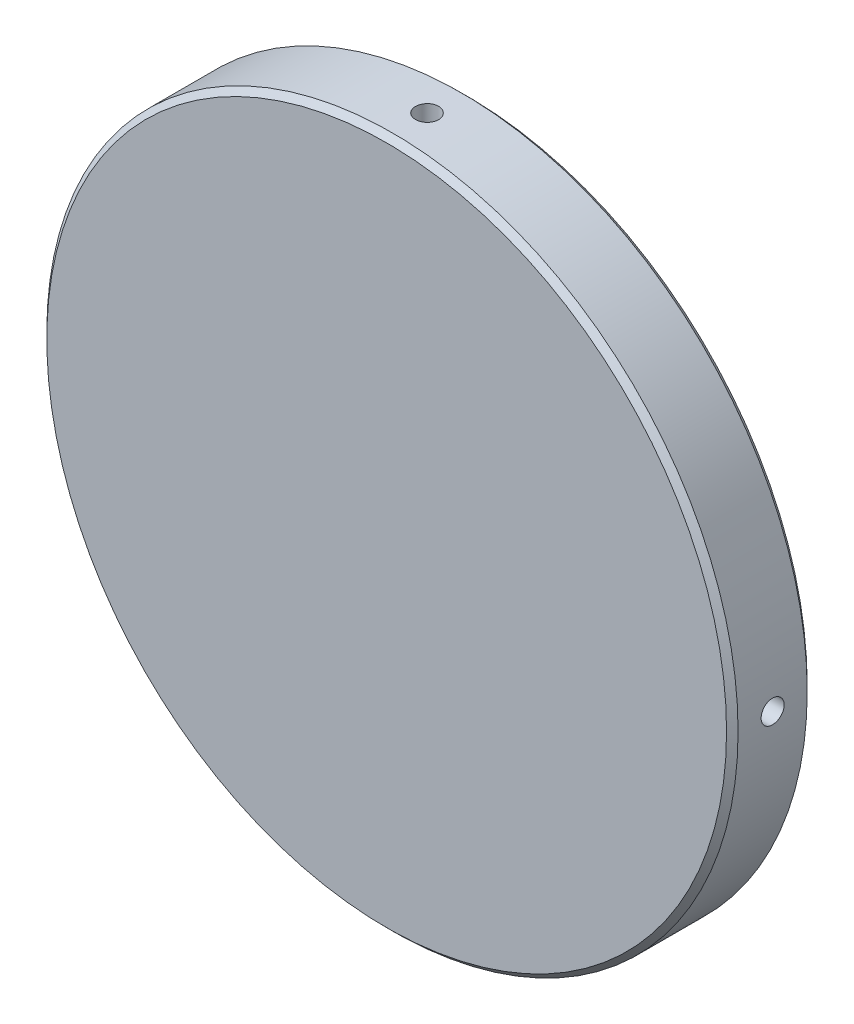
ISO-10303-21;
HEADER;
FILE_DESCRIPTION(('STEP AP214'),'2;1');
FILE_NAME('part.step','',(''),(''),'','','');
FILE_SCHEMA(('AUTOMOTIVE_DESIGN { 1 0 10303 214 1 1 1 1 }'));
ENDSEC;
DATA;
#1=APPLICATION_CONTEXT('core data for automotive mechanical design processes');
#2=APPLICATION_PROTOCOL_DEFINITION('international standard','automotive_design',2000,#1);
#3=PRODUCT_CONTEXT('',#1,'mechanical');
#4=PRODUCT('Part','Part','',(#3));
#5=PRODUCT_RELATED_PRODUCT_CATEGORY('part','',(#4));
#6=PRODUCT_DEFINITION_FORMATION('','',#4);
#7=PRODUCT_DEFINITION_CONTEXT('part definition',#1,'design');
#8=PRODUCT_DEFINITION('design','',#6,#7);
#9=PRODUCT_DEFINITION_SHAPE('','',#8);
#10=(LENGTH_UNIT() NAMED_UNIT(*) SI_UNIT(.MILLI.,.METRE.));
#11=(NAMED_UNIT(*) PLANE_ANGLE_UNIT() SI_UNIT($,.RADIAN.));
#12=(NAMED_UNIT(*) SI_UNIT($,.STERADIAN.) SOLID_ANGLE_UNIT());
#13=UNCERTAINTY_MEASURE_WITH_UNIT(LENGTH_MEASURE(1.E-05),#10,'distance_accuracy_value','');
#14=(GEOMETRIC_REPRESENTATION_CONTEXT(3) GLOBAL_UNCERTAINTY_ASSIGNED_CONTEXT((#13)) GLOBAL_UNIT_ASSIGNED_CONTEXT((#10,
#11,#12)) REPRESENTATION_CONTEXT('',''));
#15=CARTESIAN_POINT('',(0.,0.,0.));
#16=DIRECTION('',(0.,0.,1.));
#17=DIRECTION('',(1.,0.,0.));
#18=AXIS2_PLACEMENT_3D('',#15,#16,#17);
#19=CARTESIAN_POINT('',(0.,0.,7.));
#20=DIRECTION('',(0.,0.,-1.));
#21=DIRECTION('',(-1.,0.,0.));
#22=AXIS2_PLACEMENT_3D('',#19,#20,#21);
#23=CYLINDRICAL_SURFACE('',#22,60.);
#24=CARTESIAN_POINT('',(-60.,0.,2.));
#25=CARTESIAN_POINT('',(-59.9999995513187,-0.11230741052313,1.99999502990844));
#26=CARTESIAN_POINT('',(-59.999681294186,-0.224695460164296,1.99050852907639));
#27=CARTESIAN_POINT('',(-59.9984422987036,-0.446374038830086,1.95279792335916));
#28=CARTESIAN_POINT('',(-59.9975208419983,-0.555660712285292,1.92455147650631));
#29=CARTESIAN_POINT('',(-59.9951797920923,-0.767893041333408,1.85012804232512));
#30=CARTESIAN_POINT('',(-59.9937604439547,-0.870841787216842,1.80395987491397));
#31=CARTESIAN_POINT('',(-59.9905836780268,-1.06749915580559,1.69501631653345));
#32=CARTESIAN_POINT('',(-59.9888263424322,-1.16121001672323,1.63224496193006));
#33=CARTESIAN_POINT('',(-59.9851704109893,-1.33680980390584,1.49183842006948));
#34=CARTESIAN_POINT('',(-59.9832717517415,-1.41869337528628,1.41419653685396));
#35=CARTESIAN_POINT('',(-59.9795477202682,-1.56826901866575,1.24626501279386));
#36=CARTESIAN_POINT('',(-59.9777223509736,-1.63596052358297,1.15597486679462));
#37=CARTESIAN_POINT('',(-59.9743503929153,-1.75524051010277,0.965287858483878));
#38=CARTESIAN_POINT('',(-59.9728038640438,-1.80682553392657,0.864888832082895));
#39=CARTESIAN_POINT('',(-59.9701646136997,-1.89240584050054,0.656849397197971));
#40=CARTESIAN_POINT('',(-59.969071890193,-1.92640120208656,0.549209021171783));
#41=CARTESIAN_POINT('',(-59.9674639553549,-1.97582500416493,0.329785084055843));
#42=CARTESIAN_POINT('',(-59.966948527849,-1.99126039478841,0.218003090047018));
#43=CARTESIAN_POINT('',(-59.9665526527725,-2.00314751855697,-0.00656652318946101));
#44=CARTESIAN_POINT('',(-59.9666722023406,-1.99959933724309,-0.119354137883445));
#45=CARTESIAN_POINT('',(-59.9675325988073,-1.97362589161321,-0.342686209625964));
#46=CARTESIAN_POINT('',(-59.9682731985146,-1.95120813778273,-0.453231541225318));
#47=CARTESIAN_POINT('',(-59.9702918204795,-1.88814352652449,-0.668988935232722));
#48=CARTESIAN_POINT('',(-59.9715698440642,-1.84749662408271,-0.774200984470355));
#49=CARTESIAN_POINT('',(-59.974519532116,-1.74911891786985,-0.976329404843444));
#50=CARTESIAN_POINT('',(-59.9761912758355,-1.69138467396224,-1.07324410043043));
#51=CARTESIAN_POINT('',(-59.9797398703991,-1.56047369507558,-1.25600838646729));
#52=CARTESIAN_POINT('',(-59.981616721841,-1.48729691508011,-1.3418579446601));
#53=CARTESIAN_POINT('',(-59.9853650598829,-1.32753561459026,-1.50009874622253));
#54=CARTESIAN_POINT('',(-59.9872365434256,-1.24094458316856,-1.57248341633885));
#55=CARTESIAN_POINT('',(-59.9907622963121,-1.05683574100876,-1.70168908703106));
#56=CARTESIAN_POINT('',(-59.9924165656186,-0.959317928400803,-1.7585100849436));
#57=CARTESIAN_POINT('',(-59.9953214438311,-0.756120025989891,-1.85497474616285));
#58=CARTESIAN_POINT('',(-59.9965720478089,-0.650439836556257,-1.89461819975989));
#59=CARTESIAN_POINT('',(-59.9985285460505,-0.433918716243488,-1.9555982264908));
#60=CARTESIAN_POINT('',(-59.9992344421393,-0.323077802655886,-1.97693486095888));
#61=CARTESIAN_POINT('',(-60.0000217213559,-0.0994387221905755,-2.00068751794158));
#62=CARTESIAN_POINT('',(-60.0001034046765,0.0133584777184866,-2.00311263528599));
#63=CARTESIAN_POINT('',(-59.9996338463773,0.237758383791588,-1.98899712295782));
#64=CARTESIAN_POINT('',(-59.99908260567,0.349361091677574,-1.97245652062942));
#65=CARTESIAN_POINT('',(-59.9974095132298,0.568178638424188,-1.92088662431491));
#66=CARTESIAN_POINT('',(-59.9962877890404,0.675394452279853,-1.88586146287072));
#67=CARTESIAN_POINT('',(-59.9936001162878,0.882424686681642,-1.79832087928957));
#68=CARTESIAN_POINT('',(-59.9920341666112,0.982239088675622,-1.74580541331377));
#69=CARTESIAN_POINT('',(-59.9886336687176,1.17167497656022,-1.62475154384126));
#70=CARTESIAN_POINT('',(-59.9867990180468,1.26129255120757,-1.55620702260144));
#71=CARTESIAN_POINT('',(-59.9830682056634,1.42775157895841,-1.40504974877458));
#72=CARTESIAN_POINT('',(-59.9811720437624,1.50459299293887,-1.32243695310937));
#73=CARTESIAN_POINT('',(-59.9775311092141,1.64334885349281,-1.14544921391244));
#74=CARTESIAN_POINT('',(-59.9757863962767,1.70525742962325,-1.05106966664388));
#75=CARTESIAN_POINT('',(-59.9726460115744,1.81235012578567,-0.853250969732884));
#76=CARTESIAN_POINT('',(-59.9712503389258,1.85753428815806,-0.749811843026982));
#77=CARTESIAN_POINT('',(-59.96896582374,1.92988526202421,-0.536832300266313));
#78=CARTESIAN_POINT('',(-59.9680768745673,1.95705586451189,-0.427293173233704));
#79=CARTESIAN_POINT('',(-59.9669057357302,1.99262086751102,-0.205204820847732));
#80=CARTESIAN_POINT('',(-59.9666235451489,2.00101529639271,-0.0926556000427915));
#81=CARTESIAN_POINT('',(-59.96669777845,1.99878923517249,0.132199401177592));
#82=CARTESIAN_POINT('',(-59.9670538915774,1.98817799788583,0.244505273416872));
#83=CARTESIAN_POINT('',(-59.968363934379,1.94826086610197,0.465740508046499));
#84=CARTESIAN_POINT('',(-59.9693178652335,1.91895493469944,0.574669863770798));
#85=CARTESIAN_POINT('',(-59.9717159562043,1.84248173822379,0.786063084163931));
#86=CARTESIAN_POINT('',(-59.9731601241162,1.79531418912218,0.888526845989179));
#87=CARTESIAN_POINT('',(-59.9763758309566,1.68445939331078,1.0840795047629));
#88=CARTESIAN_POINT('',(-59.9781473582833,1.62077273201659,1.1771687337702));
#89=CARTESIAN_POINT('',(-59.9818189875159,1.47865855527476,1.35137347423858));
#90=CARTESIAN_POINT('',(-59.9837191380328,1.40022544652487,1.43248442144642));
#91=CARTESIAN_POINT('',(-59.9874337867795,1.23083249353713,1.58041021922717));
#92=CARTESIAN_POINT('',(-59.9892482637029,1.13986955501372,1.64722152801357));
#93=CARTESIAN_POINT('',(-59.9925877483938,0.947958781437589,1.76466546473158));
#94=CARTESIAN_POINT('',(-59.994112555947,0.847004113054066,1.81528691891958));
#95=CARTESIAN_POINT('',(-59.9966973502013,0.638101329968903,1.89880272374345));
#96=CARTESIAN_POINT('',(-59.997757890213,0.530161717027103,1.93171818701532));
#97=CARTESIAN_POINT('',(-59.9990115902528,0.351284768785126,1.97017649465873));
#98=CARTESIAN_POINT('',(-59.9993806329359,0.281508180818027,1.98134620982127));
#99=CARTESIAN_POINT('',(-59.9998749787894,0.141165016836204,1.99625952327808));
#100=CARTESIAN_POINT('',(-60.0000002820491,0.0705984411103986,2.00000312428819));
#101=CARTESIAN_POINT('',(-60.,0.,2.));
#102=B_SPLINE_CURVE_WITH_KNOTS('',3,(#24,#25,#26,#27,#28,#29,#30,#31,#32,#33,#34,#35,#36,#37,
#38,#39,#40,#41,#42,#43,#44,#45,#46,#47,#48,#49,#50,#51,#52,#53,#54,#55,#56,#57,#58,#59,#60,#61,
#62,#63,#64,#65,#66,#67,#68,#69,#70,#71,#72,#73,#74,#75,#76,#77,#78,#79,#80,#81,#82,#83,#84,#85,
#86,#87,#88,#89,#90,#91,#92,#93,#94,#95,#96,#97,#98,#99,#100,#101),.UNSPECIFIED.,.T.,.F.,(4,2,2,
2,2,2,2,2,2,2,2,2,2,2,2,2,2,2,2,2,2,2,2,2,2,2,2,2,2,2,2,2,2,2,2,2,2,2,4),(0.,0.336664535843486,
0.673730739600239,1.0106312709449,1.34744997426733,1.68442069968859,2.02140488710753,
2.3584613694532,2.69551634111805,3.03244505684617,3.3693722543557,3.70616541115424,
4.04295939961518,4.37982123984572,4.71668406207335,5.05371090398613,5.39073780357285,
5.72776881758963,6.06479870243095,6.4016664945875,6.73853380105909,7.07532582691969,
7.41211869694404,7.74904031970896,8.08596297417281,8.42301786561774,8.76007190375086,
9.09705498557287,9.43403755822315,9.77085611715359,10.1076753410018,10.4444999210432,
10.7813125660955,11.1182532222815,11.4552772368257,11.7925333556036,12.129386433475,
12.3410198420745,12.5526531732767),.UNSPECIFIED.);
#103=CARTESIAN_POINT('',(-60.,0.,2.));
#104=VERTEX_POINT('',#103);
#105=EDGE_CURVE('E37',#104,#104,#102,.T.);
#106=ORIENTED_EDGE('',*,*,#105,.T.);
#107=EDGE_LOOP('',(#106));
#108=FACE_BOUND('',#107,.T.);
#109=CARTESIAN_POINT('',(0.,-60.,2.));
#110=CARTESIAN_POINT('',(0.11230741052313,-59.9999995513187,1.99999502990845));
#111=CARTESIAN_POINT('',(0.224695460164296,-59.999681294186,1.99050852907639));
#112=CARTESIAN_POINT('',(0.446374038830086,-59.9984422987036,1.95279792335917));
#113=CARTESIAN_POINT('',(0.555660712285292,-59.9975208419983,1.92455147650631));
#114=CARTESIAN_POINT('',(0.767893041333409,-59.9951797920923,1.85012804232512));
#115=CARTESIAN_POINT('',(0.870841787216842,-59.9937604439547,1.80395987491397));
#116=CARTESIAN_POINT('',(1.06749915580559,-59.9905836780268,1.69501631653345));
#117=CARTESIAN_POINT('',(1.16121001672323,-59.9888263424322,1.63224496193006));
#118=CARTESIAN_POINT('',(1.33680980390584,-59.9851704109893,1.49183842006948));
#119=CARTESIAN_POINT('',(1.41869337528628,-59.9832717517415,1.41419653685396));
#120=CARTESIAN_POINT('',(1.56826901866575,-59.9795477202682,1.24626501279386));
#121=CARTESIAN_POINT('',(1.63596052358297,-59.9777223509736,1.15597486679462));
#122=CARTESIAN_POINT('',(1.75524051010277,-59.9743503929153,0.965287858483878));
#123=CARTESIAN_POINT('',(1.80682553392657,-59.9728038640438,0.864888832082895));
#124=CARTESIAN_POINT('',(1.89240584050054,-59.9701646136997,0.65684939719797));
#125=CARTESIAN_POINT('',(1.92640120208656,-59.969071890193,0.549209021171783));
#126=CARTESIAN_POINT('',(1.97582500416493,-59.9674639553549,0.329785084055842));
#127=CARTESIAN_POINT('',(1.99126039478841,-59.966948527849,0.218003090047017));
#128=CARTESIAN_POINT('',(2.00314751855697,-59.9665526527725,-0.00656652318946153));
#129=CARTESIAN_POINT('',(1.99959933724309,-59.9666722023406,-0.119354137883445));
#130=CARTESIAN_POINT('',(1.97362589161321,-59.9675325988073,-0.342686209625965));
#131=CARTESIAN_POINT('',(1.95120813778273,-59.9682731985146,-0.453231541225318));
#132=CARTESIAN_POINT('',(1.88814352652449,-59.9702918204795,-0.668988935232722));
#133=CARTESIAN_POINT('',(1.84749662408271,-59.9715698440642,-0.774200984470356));
#134=CARTESIAN_POINT('',(1.74911891786985,-59.974519532116,-0.976329404843444));
#135=CARTESIAN_POINT('',(1.69138467396224,-59.9761912758355,-1.07324410043043));
#136=CARTESIAN_POINT('',(1.56047369507558,-59.9797398703991,-1.25600838646729));
#137=CARTESIAN_POINT('',(1.48729691508011,-59.981616721841,-1.3418579446601));
#138=CARTESIAN_POINT('',(1.32753561459026,-59.9853650598829,-1.50009874622253));
#139=CARTESIAN_POINT('',(1.24094458316856,-59.9872365434256,-1.57248341633885));
#140=CARTESIAN_POINT('',(1.05683574100876,-59.9907622963121,-1.70168908703106));
#141=CARTESIAN_POINT('',(0.959317928400803,-59.9924165656186,-1.7585100849436));
#142=CARTESIAN_POINT('',(0.756120025989891,-59.9953214438311,-1.85497474616285));
#143=CARTESIAN_POINT('',(0.650439836556257,-59.9965720478089,-1.89461819975989));
#144=CARTESIAN_POINT('',(0.433918716243488,-59.9985285460505,-1.95559822649081));
#145=CARTESIAN_POINT('',(0.323077802655886,-59.9992344421393,-1.97693486095888));
#146=CARTESIAN_POINT('',(0.0994387221905752,-60.0000217213559,-2.00068751794158));
#147=CARTESIAN_POINT('',(-0.0133584777184873,-60.0001034046765,-2.00311263528599));
#148=CARTESIAN_POINT('',(-0.237758383791588,-59.9996338463773,-1.98899712295782));
#149=CARTESIAN_POINT('',(-0.349361091677574,-59.99908260567,-1.97245652062942));
#150=CARTESIAN_POINT('',(-0.568178638424188,-59.9974095132298,-1.92088662431491));
#151=CARTESIAN_POINT('',(-0.675394452279852,-59.9962877890404,-1.88586146287072));
#152=CARTESIAN_POINT('',(-0.882424686681642,-59.9936001162878,-1.79832087928957));
#153=CARTESIAN_POINT('',(-0.982239088675622,-59.9920341666112,-1.74580541331377));
#154=CARTESIAN_POINT('',(-1.17167497656022,-59.9886336687176,-1.62475154384126));
#155=CARTESIAN_POINT('',(-1.26129255120757,-59.9867990180468,-1.55620702260144));
#156=CARTESIAN_POINT('',(-1.42775157895841,-59.9830682056634,-1.40504974877458));
#157=CARTESIAN_POINT('',(-1.50459299293887,-59.9811720437624,-1.32243695310937));
#158=CARTESIAN_POINT('',(-1.64334885349281,-59.9775311092141,-1.14544921391244));
#159=CARTESIAN_POINT('',(-1.70525742962325,-59.9757863962767,-1.05106966664388));
#160=CARTESIAN_POINT('',(-1.81235012578567,-59.9726460115744,-0.853250969732884));
#161=CARTESIAN_POINT('',(-1.85753428815806,-59.9712503389258,-0.749811843026982));
#162=CARTESIAN_POINT('',(-1.92988526202421,-59.96896582374,-0.536832300266313));
#163=CARTESIAN_POINT('',(-1.95705586451189,-59.9680768745673,-0.427293173233704));
#164=CARTESIAN_POINT('',(-1.99262086751102,-59.9669057357302,-0.205204820847732));
#165=CARTESIAN_POINT('',(-2.00101529639271,-59.9666235451489,-0.0926556000427914));
#166=CARTESIAN_POINT('',(-1.99878923517249,-59.96669777845,0.132199401177592));
#167=CARTESIAN_POINT('',(-1.98817799788583,-59.9670538915774,0.244505273416872));
#168=CARTESIAN_POINT('',(-1.94826086610197,-59.968363934379,0.465740508046499));
#169=CARTESIAN_POINT('',(-1.91895493469944,-59.9693178652335,0.574669863770798));
#170=CARTESIAN_POINT('',(-1.84248173822379,-59.9717159562043,0.786063084163932));
#171=CARTESIAN_POINT('',(-1.79531418912218,-59.9731601241162,0.888526845989179));
#172=CARTESIAN_POINT('',(-1.68445939331078,-59.9763758309566,1.0840795047629));
#173=CARTESIAN_POINT('',(-1.62077273201659,-59.9781473582833,1.1771687337702));
#174=CARTESIAN_POINT('',(-1.47865855527476,-59.9818189875159,1.35137347423858));
#175=CARTESIAN_POINT('',(-1.40022544652487,-59.9837191380328,1.43248442144643));
#176=CARTESIAN_POINT('',(-1.23083249353713,-59.9874337867795,1.58041021922717));
#177=CARTESIAN_POINT('',(-1.13986955501372,-59.9892482637029,1.64722152801357));
#178=CARTESIAN_POINT('',(-0.94795878143759,-59.9925877483938,1.76466546473158));
#179=CARTESIAN_POINT('',(-0.847004113054067,-59.994112555947,1.81528691891958));
#180=CARTESIAN_POINT('',(-0.638101329968904,-59.9966973502013,1.89880272374345));
#181=CARTESIAN_POINT('',(-0.530161717027103,-59.997757890213,1.93171818701532));
#182=CARTESIAN_POINT('',(-0.351284768785126,-59.9990115902528,1.97017649465874));
#183=CARTESIAN_POINT('',(-0.281508180818027,-59.9993806329359,1.98134620982127));
#184=CARTESIAN_POINT('',(-0.141165016836204,-59.9998749787894,1.99625952327808));
#185=CARTESIAN_POINT('',(-0.0705984411103986,-60.0000002820491,2.00000312428819));
#186=CARTESIAN_POINT('',(0.,-60.,2.));
#187=B_SPLINE_CURVE_WITH_KNOTS('',3,(#109,#110,#111,#112,#113,#114,#115,#116,#117,#118,#119,
#120,#121,#122,#123,#124,#125,#126,#127,#128,#129,#130,#131,#132,#133,#134,#135,#136,#137,#138,
#139,#140,#141,#142,#143,#144,#145,#146,#147,#148,#149,#150,#151,#152,#153,#154,#155,#156,#157,
#158,#159,#160,#161,#162,#163,#164,#165,#166,#167,#168,#169,#170,#171,#172,#173,#174,#175,#176,
#177,#178,#179,#180,#181,#182,#183,#184,#185,#186),.UNSPECIFIED.,.T.,.F.,(4,2,2,2,2,2,2,2,2,2,2,
2,2,2,2,2,2,2,2,2,2,2,2,2,2,2,2,2,2,2,2,2,2,2,2,2,2,2,4),(0.,0.336664535843486,
0.673730739600239,1.0106312709449,1.34744997426733,1.68442069968859,2.02140488710753,
2.3584613694532,2.69551634111805,3.03244505684617,3.3693722543557,3.70616541115424,
4.04295939961518,4.37982123984572,4.71668406207335,5.05371090398613,5.39073780357286,
5.72776881758963,6.06479870243095,6.40166649458751,6.73853380105909,7.07532582691969,
7.41211869694404,7.74904031970896,8.08596297417281,8.42301786561774,8.76007190375086,
9.09705498557287,9.43403755822315,9.77085611715359,10.1076753410018,10.4444999210432,
10.7813125660955,11.1182532222815,11.4552772368257,11.7925333556036,12.129386433475,
12.3410198420745,12.5526531732767),.UNSPECIFIED.);
#188=CARTESIAN_POINT('',(0.,-60.,2.));
#189=VERTEX_POINT('',#188);
#190=EDGE_CURVE('E64',#189,#189,#187,.T.);
#191=ORIENTED_EDGE('',*,*,#190,.T.);
#192=EDGE_LOOP('',(#191));
#193=FACE_BOUND('',#192,.T.);
#194=CARTESIAN_POINT('',(0.,0.,-6.00000000000002));
#195=DIRECTION('',(0.,0.,1.));
#196=DIRECTION('',(1.,0.,0.));
#197=AXIS2_PLACEMENT_3D('',#194,#195,#196);
#198=CIRCLE('',#197,60.);
#199=CARTESIAN_POINT('',(60.,0.,-6.00000000000002));
#200=VERTEX_POINT('',#199);
#201=EDGE_CURVE('E51',#200,#200,#198,.T.);
#202=ORIENTED_EDGE('',*,*,#201,.T.);
#203=EDGE_LOOP('',(#202));
#204=FACE_BOUND('',#203,.T.);
#205=CARTESIAN_POINT('',(0.,0.,5.99999999999999));
#206=DIRECTION('',(0.,0.,1.));
#207=DIRECTION('',(1.,0.,0.));
#208=AXIS2_PLACEMENT_3D('',#205,#206,#207);
#209=CIRCLE('',#208,60.);
#210=CARTESIAN_POINT('',(60.,0.,5.99999999999999));
#211=VERTEX_POINT('',#210);
#212=EDGE_CURVE('E62',#211,#211,#209,.F.);
#213=ORIENTED_EDGE('',*,*,#212,.T.);
#214=EDGE_LOOP('',(#213));
#215=FACE_BOUND('',#214,.T.);
#216=CARTESIAN_POINT('',(0.,60.,-2.));
#217=CARTESIAN_POINT('',(-0.11230741052313,59.9999995513187,-1.99999502990845));
#218=CARTESIAN_POINT('',(-0.224695460164296,59.999681294186,-1.99050852907639));
#219=CARTESIAN_POINT('',(-0.446374038830086,59.9984422987036,-1.95279792335917));
#220=CARTESIAN_POINT('',(-0.555660712285292,59.9975208419983,-1.92455147650631));
#221=CARTESIAN_POINT('',(-0.767893041333409,59.9951797920923,-1.85012804232512));
#222=CARTESIAN_POINT('',(-0.870841787216842,59.9937604439547,-1.80395987491397));
#223=CARTESIAN_POINT('',(-1.06749915580559,59.9905836780268,-1.69501631653345));
#224=CARTESIAN_POINT('',(-1.16121001672323,59.9888263424322,-1.63224496193006));
#225=CARTESIAN_POINT('',(-1.33680980390584,59.9851704109893,-1.49183842006948));
#226=CARTESIAN_POINT('',(-1.41869337528628,59.9832717517415,-1.41419653685396));
#227=CARTESIAN_POINT('',(-1.56826901866575,59.9795477202682,-1.24626501279386));
#228=CARTESIAN_POINT('',(-1.63596052358297,59.9777223509736,-1.15597486679462));
#229=CARTESIAN_POINT('',(-1.75524051010277,59.9743503929153,-0.965287858483878));
#230=CARTESIAN_POINT('',(-1.80682553392657,59.9728038640438,-0.864888832082895));
#231=CARTESIAN_POINT('',(-1.89240584050054,59.9701646136997,-0.65684939719797));
#232=CARTESIAN_POINT('',(-1.92640120208656,59.969071890193,-0.549209021171783));
#233=CARTESIAN_POINT('',(-1.97582500416493,59.9674639553549,-0.329785084055842));
#234=CARTESIAN_POINT('',(-1.99126039478841,59.966948527849,-0.218003090047017));
#235=CARTESIAN_POINT('',(-2.00314751855697,59.9665526527725,0.00656652318946153));
#236=CARTESIAN_POINT('',(-1.99959933724309,59.9666722023406,0.119354137883445));
#237=CARTESIAN_POINT('',(-1.97362589161321,59.9675325988073,0.342686209625965));
#238=CARTESIAN_POINT('',(-1.95120813778273,59.9682731985146,0.453231541225318));
#239=CARTESIAN_POINT('',(-1.88814352652449,59.9702918204795,0.668988935232722));
#240=CARTESIAN_POINT('',(-1.84749662408271,59.9715698440642,0.774200984470356));
#241=CARTESIAN_POINT('',(-1.74911891786985,59.974519532116,0.976329404843444));
#242=CARTESIAN_POINT('',(-1.69138467396224,59.9761912758355,1.07324410043043));
#243=CARTESIAN_POINT('',(-1.56047369507558,59.9797398703991,1.25600838646729));
#244=CARTESIAN_POINT('',(-1.48729691508011,59.981616721841,1.3418579446601));
#245=CARTESIAN_POINT('',(-1.32753561459026,59.9853650598829,1.50009874622253));
#246=CARTESIAN_POINT('',(-1.24094458316856,59.9872365434256,1.57248341633885));
#247=CARTESIAN_POINT('',(-1.05683574100876,59.9907622963121,1.70168908703106));
#248=CARTESIAN_POINT('',(-0.959317928400803,59.9924165656186,1.7585100849436));
#249=CARTESIAN_POINT('',(-0.756120025989891,59.9953214438311,1.85497474616285));
#250=CARTESIAN_POINT('',(-0.650439836556257,59.9965720478089,1.89461819975989));
#251=CARTESIAN_POINT('',(-0.433918716243488,59.9985285460505,1.95559822649081));
#252=CARTESIAN_POINT('',(-0.323077802655886,59.9992344421393,1.97693486095888));
#253=CARTESIAN_POINT('',(-0.0994387221905752,60.0000217213559,2.00068751794158));
#254=CARTESIAN_POINT('',(0.0133584777184873,60.0001034046765,2.00311263528599));
#255=CARTESIAN_POINT('',(0.237758383791588,59.9996338463773,1.98899712295782));
#256=CARTESIAN_POINT('',(0.349361091677574,59.99908260567,1.97245652062942));
#257=CARTESIAN_POINT('',(0.568178638424188,59.9974095132298,1.92088662431491));
#258=CARTESIAN_POINT('',(0.675394452279852,59.9962877890404,1.88586146287072));
#259=CARTESIAN_POINT('',(0.882424686681642,59.9936001162878,1.79832087928957));
#260=CARTESIAN_POINT('',(0.982239088675622,59.9920341666112,1.74580541331377));
#261=CARTESIAN_POINT('',(1.17167497656022,59.9886336687176,1.62475154384126));
#262=CARTESIAN_POINT('',(1.26129255120757,59.9867990180468,1.55620702260144));
#263=CARTESIAN_POINT('',(1.42775157895841,59.9830682056634,1.40504974877458));
#264=CARTESIAN_POINT('',(1.50459299293887,59.9811720437624,1.32243695310937));
#265=CARTESIAN_POINT('',(1.64334885349281,59.9775311092141,1.14544921391244));
#266=CARTESIAN_POINT('',(1.70525742962325,59.9757863962767,1.05106966664388));
#267=CARTESIAN_POINT('',(1.81235012578567,59.9726460115744,0.853250969732884));
#268=CARTESIAN_POINT('',(1.85753428815806,59.9712503389258,0.749811843026982));
#269=CARTESIAN_POINT('',(1.92988526202421,59.96896582374,0.536832300266313));
#270=CARTESIAN_POINT('',(1.95705586451189,59.9680768745673,0.427293173233704));
#271=CARTESIAN_POINT('',(1.99262086751102,59.9669057357302,0.205204820847732));
#272=CARTESIAN_POINT('',(2.00101529639271,59.9666235451489,0.0926556000427914));
#273=CARTESIAN_POINT('',(1.99878923517249,59.96669777845,-0.132199401177592));
#274=CARTESIAN_POINT('',(1.98817799788583,59.9670538915774,-0.244505273416872));
#275=CARTESIAN_POINT('',(1.94826086610197,59.968363934379,-0.465740508046499));
#276=CARTESIAN_POINT('',(1.91895493469944,59.9693178652335,-0.574669863770798));
#277=CARTESIAN_POINT('',(1.84248173822379,59.9717159562043,-0.786063084163932));
#278=CARTESIAN_POINT('',(1.79531418912218,59.9731601241162,-0.888526845989179));
#279=CARTESIAN_POINT('',(1.68445939331078,59.9763758309566,-1.0840795047629));
#280=CARTESIAN_POINT('',(1.62077273201659,59.9781473582833,-1.1771687337702));
#281=CARTESIAN_POINT('',(1.47865855527476,59.9818189875159,-1.35137347423858));
#282=CARTESIAN_POINT('',(1.40022544652487,59.9837191380328,-1.43248442144643));
#283=CARTESIAN_POINT('',(1.23083249353713,59.9874337867795,-1.58041021922717));
#284=CARTESIAN_POINT('',(1.13986955501372,59.9892482637029,-1.64722152801357));
#285=CARTESIAN_POINT('',(0.94795878143759,59.9925877483938,-1.76466546473158));
#286=CARTESIAN_POINT('',(0.847004113054067,59.994112555947,-1.81528691891958));
#287=CARTESIAN_POINT('',(0.638101329968904,59.9966973502013,-1.89880272374345));
#288=CARTESIAN_POINT('',(0.530161717027103,59.997757890213,-1.93171818701532));
#289=CARTESIAN_POINT('',(0.351284768785126,59.9990115902528,-1.97017649465874));
#290=CARTESIAN_POINT('',(0.281508180818027,59.9993806329359,-1.98134620982127));
#291=CARTESIAN_POINT('',(0.141165016836204,59.9998749787894,-1.99625952327808));
#292=CARTESIAN_POINT('',(0.0705984411103986,60.0000002820491,-2.00000312428819));
#293=CARTESIAN_POINT('',(0.,60.,-2.));
#294=B_SPLINE_CURVE_WITH_KNOTS('',3,(#216,#217,#218,#219,#220,#221,#222,#223,#224,#225,#226,
#227,#228,#229,#230,#231,#232,#233,#234,#235,#236,#237,#238,#239,#240,#241,#242,#243,#244,#245,
#246,#247,#248,#249,#250,#251,#252,#253,#254,#255,#256,#257,#258,#259,#260,#261,#262,#263,#264,
#265,#266,#267,#268,#269,#270,#271,#272,#273,#274,#275,#276,#277,#278,#279,#280,#281,#282,#283,
#284,#285,#286,#287,#288,#289,#290,#291,#292,#293),.UNSPECIFIED.,.T.,.F.,(4,2,2,2,2,2,2,2,2,2,2,
2,2,2,2,2,2,2,2,2,2,2,2,2,2,2,2,2,2,2,2,2,2,2,2,2,2,2,4),(0.,0.336664535843486,
0.673730739600239,1.0106312709449,1.34744997426733,1.68442069968859,2.02140488710753,
2.3584613694532,2.69551634111805,3.03244505684617,3.3693722543557,3.70616541115424,
4.04295939961518,4.37982123984572,4.71668406207335,5.05371090398613,5.39073780357286,
5.72776881758963,6.06479870243095,6.40166649458751,6.73853380105909,7.07532582691969,
7.41211869694404,7.74904031970896,8.08596297417281,8.42301786561774,8.76007190375086,
9.09705498557287,9.43403755822315,9.77085611715359,10.1076753410018,10.4444999210432,
10.7813125660955,11.1182532222815,11.4552772368257,11.7925333556036,12.129386433475,
12.3410198420745,12.5526531732767),.UNSPECIFIED.);
#295=CARTESIAN_POINT('',(0.,60.,-2.));
#296=VERTEX_POINT('',#295);
#297=EDGE_CURVE('E55',#296,#296,#294,.T.);
#298=ORIENTED_EDGE('',*,*,#297,.F.);
#299=EDGE_LOOP('',(#298));
#300=FACE_BOUND('',#299,.T.);
#301=CARTESIAN_POINT('',(60.,0.,2.));
#302=CARTESIAN_POINT('',(59.9999995513187,-0.11230741052313,1.99999502990844));
#303=CARTESIAN_POINT('',(59.999681294186,-0.224695460164296,1.99050852907639));
#304=CARTESIAN_POINT('',(59.9984422987036,-0.446374038830086,1.95279792335916));
#305=CARTESIAN_POINT('',(59.9975208419983,-0.555660712285292,1.92455147650631));
#306=CARTESIAN_POINT('',(59.9951797920923,-0.767893041333408,1.85012804232512));
#307=CARTESIAN_POINT('',(59.9937604439547,-0.870841787216842,1.80395987491397));
#308=CARTESIAN_POINT('',(59.9905836780268,-1.06749915580559,1.69501631653345));
#309=CARTESIAN_POINT('',(59.9888263424322,-1.16121001672323,1.63224496193006));
#310=CARTESIAN_POINT('',(59.9851704109893,-1.33680980390584,1.49183842006948));
#311=CARTESIAN_POINT('',(59.9832717517415,-1.41869337528628,1.41419653685396));
#312=CARTESIAN_POINT('',(59.9795477202682,-1.56826901866575,1.24626501279386));
#313=CARTESIAN_POINT('',(59.9777223509736,-1.63596052358297,1.15597486679462));
#314=CARTESIAN_POINT('',(59.9743503929153,-1.75524051010277,0.965287858483878));
#315=CARTESIAN_POINT('',(59.9728038640438,-1.80682553392657,0.864888832082895));
#316=CARTESIAN_POINT('',(59.9701646136997,-1.89240584050054,0.656849397197971));
#317=CARTESIAN_POINT('',(59.969071890193,-1.92640120208656,0.549209021171783));
#318=CARTESIAN_POINT('',(59.9674639553549,-1.97582500416493,0.329785084055843));
#319=CARTESIAN_POINT('',(59.966948527849,-1.99126039478841,0.218003090047018));
#320=CARTESIAN_POINT('',(59.9665526527725,-2.00314751855697,-0.00656652318946101));
#321=CARTESIAN_POINT('',(59.9666722023406,-1.99959933724309,-0.119354137883445));
#322=CARTESIAN_POINT('',(59.9675325988073,-1.97362589161321,-0.342686209625964));
#323=CARTESIAN_POINT('',(59.9682731985146,-1.95120813778273,-0.453231541225318));
#324=CARTESIAN_POINT('',(59.9702918204795,-1.88814352652449,-0.668988935232722));
#325=CARTESIAN_POINT('',(59.9715698440642,-1.84749662408271,-0.774200984470355));
#326=CARTESIAN_POINT('',(59.974519532116,-1.74911891786985,-0.976329404843444));
#327=CARTESIAN_POINT('',(59.9761912758355,-1.69138467396224,-1.07324410043043));
#328=CARTESIAN_POINT('',(59.9797398703991,-1.56047369507558,-1.25600838646729));
#329=CARTESIAN_POINT('',(59.981616721841,-1.48729691508011,-1.3418579446601));
#330=CARTESIAN_POINT('',(59.9853650598829,-1.32753561459026,-1.50009874622253));
#331=CARTESIAN_POINT('',(59.9872365434256,-1.24094458316856,-1.57248341633885));
#332=CARTESIAN_POINT('',(59.9907622963121,-1.05683574100876,-1.70168908703106));
#333=CARTESIAN_POINT('',(59.9924165656186,-0.959317928400803,-1.7585100849436));
#334=CARTESIAN_POINT('',(59.9953214438311,-0.756120025989891,-1.85497474616285));
#335=CARTESIAN_POINT('',(59.9965720478089,-0.650439836556257,-1.89461819975989));
#336=CARTESIAN_POINT('',(59.9985285460505,-0.433918716243488,-1.9555982264908));
#337=CARTESIAN_POINT('',(59.9992344421393,-0.323077802655886,-1.97693486095888));
#338=CARTESIAN_POINT('',(60.0000217213559,-0.0994387221905755,-2.00068751794158));
#339=CARTESIAN_POINT('',(60.0001034046765,0.0133584777184866,-2.00311263528599));
#340=CARTESIAN_POINT('',(59.9996338463773,0.237758383791588,-1.98899712295782));
#341=CARTESIAN_POINT('',(59.99908260567,0.349361091677574,-1.97245652062942));
#342=CARTESIAN_POINT('',(59.9974095132298,0.568178638424188,-1.92088662431491));
#343=CARTESIAN_POINT('',(59.9962877890404,0.675394452279853,-1.88586146287072));
#344=CARTESIAN_POINT('',(59.9936001162878,0.882424686681642,-1.79832087928957));
#345=CARTESIAN_POINT('',(59.9920341666112,0.982239088675622,-1.74580541331377));
#346=CARTESIAN_POINT('',(59.9886336687176,1.17167497656022,-1.62475154384126));
#347=CARTESIAN_POINT('',(59.9867990180468,1.26129255120757,-1.55620702260144));
#348=CARTESIAN_POINT('',(59.9830682056634,1.42775157895841,-1.40504974877458));
#349=CARTESIAN_POINT('',(59.9811720437624,1.50459299293887,-1.32243695310937));
#350=CARTESIAN_POINT('',(59.9775311092141,1.64334885349281,-1.14544921391244));
#351=CARTESIAN_POINT('',(59.9757863962767,1.70525742962325,-1.05106966664388));
#352=CARTESIAN_POINT('',(59.9726460115744,1.81235012578567,-0.853250969732884));
#353=CARTESIAN_POINT('',(59.9712503389258,1.85753428815806,-0.749811843026982));
#354=CARTESIAN_POINT('',(59.96896582374,1.92988526202421,-0.536832300266313));
#355=CARTESIAN_POINT('',(59.9680768745673,1.95705586451189,-0.427293173233704));
#356=CARTESIAN_POINT('',(59.9669057357302,1.99262086751102,-0.205204820847732));
#357=CARTESIAN_POINT('',(59.9666235451489,2.00101529639271,-0.0926556000427915));
#358=CARTESIAN_POINT('',(59.96669777845,1.99878923517249,0.132199401177592));
#359=CARTESIAN_POINT('',(59.9670538915774,1.98817799788583,0.244505273416872));
#360=CARTESIAN_POINT('',(59.968363934379,1.94826086610197,0.465740508046499));
#361=CARTESIAN_POINT('',(59.9693178652335,1.91895493469944,0.574669863770798));
#362=CARTESIAN_POINT('',(59.9717159562043,1.84248173822379,0.786063084163931));
#363=CARTESIAN_POINT('',(59.9731601241162,1.79531418912218,0.888526845989179));
#364=CARTESIAN_POINT('',(59.9763758309566,1.68445939331078,1.0840795047629));
#365=CARTESIAN_POINT('',(59.9781473582833,1.62077273201659,1.1771687337702));
#366=CARTESIAN_POINT('',(59.9818189875159,1.47865855527476,1.35137347423858));
#367=CARTESIAN_POINT('',(59.9837191380328,1.40022544652487,1.43248442144642));
#368=CARTESIAN_POINT('',(59.9874337867795,1.23083249353713,1.58041021922717));
#369=CARTESIAN_POINT('',(59.9892482637029,1.13986955501372,1.64722152801357));
#370=CARTESIAN_POINT('',(59.9925877483938,0.947958781437589,1.76466546473158));
#371=CARTESIAN_POINT('',(59.994112555947,0.847004113054066,1.81528691891958));
#372=CARTESIAN_POINT('',(59.9966973502013,0.638101329968903,1.89880272374345));
#373=CARTESIAN_POINT('',(59.997757890213,0.530161717027103,1.93171818701532));
#374=CARTESIAN_POINT('',(59.9990115902528,0.351284768785126,1.97017649465873));
#375=CARTESIAN_POINT('',(59.9993806329359,0.281508180818027,1.98134620982127));
#376=CARTESIAN_POINT('',(59.9998749787894,0.141165016836204,1.99625952327808));
#377=CARTESIAN_POINT('',(60.0000002820491,0.0705984411103986,2.00000312428819));
#378=CARTESIAN_POINT('',(60.,0.,2.));
#379=B_SPLINE_CURVE_WITH_KNOTS('',3,(#301,#302,#303,#304,#305,#306,#307,#308,#309,#310,#311,
#312,#313,#314,#315,#316,#317,#318,#319,#320,#321,#322,#323,#324,#325,#326,#327,#328,#329,#330,
#331,#332,#333,#334,#335,#336,#337,#338,#339,#340,#341,#342,#343,#344,#345,#346,#347,#348,#349,
#350,#351,#352,#353,#354,#355,#356,#357,#358,#359,#360,#361,#362,#363,#364,#365,#366,#367,#368,
#369,#370,#371,#372,#373,#374,#375,#376,#377,#378),.UNSPECIFIED.,.T.,.F.,(4,2,2,2,2,2,2,2,2,2,2,
2,2,2,2,2,2,2,2,2,2,2,2,2,2,2,2,2,2,2,2,2,2,2,2,2,2,2,4),(0.,0.336664535843486,
0.673730739600239,1.0106312709449,1.34744997426733,1.68442069968859,2.02140488710753,
2.3584613694532,2.69551634111805,3.03244505684617,3.3693722543557,3.70616541115424,
4.04295939961518,4.37982123984572,4.71668406207335,5.05371090398613,5.39073780357285,
5.72776881758963,6.06479870243095,6.4016664945875,6.73853380105909,7.07532582691969,
7.41211869694404,7.74904031970896,8.08596297417281,8.42301786561774,8.76007190375086,
9.09705498557287,9.43403755822315,9.77085611715359,10.1076753410018,10.4444999210432,
10.7813125660955,11.1182532222815,11.4552772368257,11.7925333556036,12.129386433475,
12.3410198420745,12.5526531732767),.UNSPECIFIED.);
#380=CARTESIAN_POINT('',(60.,0.,2.));
#381=VERTEX_POINT('',#380);
#382=EDGE_CURVE('E108',#381,#381,#379,.T.);
#383=ORIENTED_EDGE('',*,*,#382,.F.);
#384=EDGE_LOOP('',(#383));
#385=FACE_BOUND('',#384,.T.);
#386=ADVANCED_FACE('F32',(#108,#193,#204,#215,#300,#385),#23,.T.);
#387=CARTESIAN_POINT('',(0.,0.,7.));
#388=DIRECTION('',(0.,0.,1.));
#389=DIRECTION('',(1.,0.,0.));
#390=AXIS2_PLACEMENT_3D('',#387,#388,#389);
#391=PLANE('',#390);
#392=CARTESIAN_POINT('',(0.,0.,7.));
#393=DIRECTION('',(0.,0.,1.));
#394=DIRECTION('',(1.,0.,0.));
#395=AXIS2_PLACEMENT_3D('',#392,#393,#394);
#396=CIRCLE('',#395,59.);
#397=CARTESIAN_POINT('',(59.,0.,7.));
#398=VERTEX_POINT('',#397);
#399=EDGE_CURVE('E10',#398,#398,#396,.T.);
#400=ORIENTED_EDGE('',*,*,#399,.T.);
#401=EDGE_LOOP('',(#400));
#402=FACE_BOUND('',#401,.T.);
#403=ADVANCED_FACE('F78',(#402),#391,.T.);
#404=CARTESIAN_POINT('',(0.,0.,-7.));
#405=DIRECTION('',(0.,0.,1.));
#406=DIRECTION('',(1.,0.,0.));
#407=AXIS2_PLACEMENT_3D('',#404,#405,#406);
#408=PLANE('',#407);
#409=CARTESIAN_POINT('',(0.,0.,-7.));
#410=DIRECTION('',(0.,0.,1.));
#411=DIRECTION('',(1.,0.,0.));
#412=AXIS2_PLACEMENT_3D('',#409,#410,#411);
#413=CIRCLE('',#412,59.);
#414=CARTESIAN_POINT('',(59.,0.,-7.));
#415=VERTEX_POINT('',#414);
#416=EDGE_CURVE('E46',#415,#415,#413,.F.);
#417=ORIENTED_EDGE('',*,*,#416,.T.);
#418=EDGE_LOOP('',(#417));
#419=FACE_BOUND('',#418,.T.);
#420=ADVANCED_FACE('F80',(#419),#408,.F.);
#421=CARTESIAN_POINT('',(0.,0.,-6.00000000000002));
#422=DIRECTION('',(0.,0.,1.));
#423=DIRECTION('',(1.,0.,0.));
#424=AXIS2_PLACEMENT_3D('',#421,#422,#423);
#425=CONICAL_SURFACE('',#424,60.,0.785398163397455);
#426=ORIENTED_EDGE('',*,*,#416,.F.);
#427=EDGE_LOOP('',(#426));
#428=FACE_BOUND('',#427,.T.);
#429=ORIENTED_EDGE('',*,*,#201,.F.);
#430=EDGE_LOOP('',(#429));
#431=FACE_BOUND('',#430,.T.);
#432=ADVANCED_FACE('F82',(#428,#431),#425,.T.);
#433=CARTESIAN_POINT('',(0.,0.,7.));
#434=DIRECTION('',(0.,0.,-1.));
#435=DIRECTION('',(-1.,0.,0.));
#436=AXIS2_PLACEMENT_3D('',#433,#434,#435);
#437=CONICAL_SURFACE('',#436,59.,0.785398163397434);
#438=ORIENTED_EDGE('',*,*,#212,.F.);
#439=EDGE_LOOP('',(#438));
#440=FACE_BOUND('',#439,.T.);
#441=ORIENTED_EDGE('',*,*,#399,.F.);
#442=EDGE_LOOP('',(#441));
#443=FACE_BOUND('',#442,.T.);
#444=ADVANCED_FACE('F35',(#440,#443),#437,.T.);
#445=CARTESIAN_POINT('',(0.,65.,0.));
#446=DIRECTION('',(0.,-1.,0.));
#447=DIRECTION('',(0.,0.,-1.));
#448=AXIS2_PLACEMENT_3D('',#445,#446,#447);
#449=CYLINDRICAL_SURFACE('',#448,2.);
#450=CARTESIAN_POINT('',(0.,55.,0.));
#451=DIRECTION('',(0.,1.,0.));
#452=DIRECTION('',(0.,0.,1.));
#453=AXIS2_PLACEMENT_3D('',#450,#451,#452);
#454=CIRCLE('',#453,2.);
#455=CARTESIAN_POINT('',(0.,55.,2.));
#456=VERTEX_POINT('',#455);
#457=EDGE_CURVE('E63',#456,#456,#454,.T.);
#458=ORIENTED_EDGE('',*,*,#457,.F.);
#459=EDGE_LOOP('',(#458));
#460=FACE_BOUND('',#459,.T.);
#461=ORIENTED_EDGE('',*,*,#297,.T.);
#462=EDGE_LOOP('',(#461));
#463=FACE_BOUND('',#462,.T.);
#464=ADVANCED_FACE('F71',(#460,#463),#449,.F.);
#465=CARTESIAN_POINT('',(0.,55.,0.));
#466=DIRECTION('',(0.,1.,0.));
#467=DIRECTION('',(0.,0.,1.));
#468=AXIS2_PLACEMENT_3D('',#465,#466,#467);
#469=PLANE('',#468);
#470=ORIENTED_EDGE('',*,*,#457,.T.);
#471=EDGE_LOOP('',(#470));
#472=FACE_BOUND('',#471,.T.);
#473=ADVANCED_FACE('F76',(#472),#469,.T.);
#474=CARTESIAN_POINT('',(0.,-65.,0.));
#475=DIRECTION('',(0.,1.,0.));
#476=DIRECTION('',(0.,0.,1.));
#477=AXIS2_PLACEMENT_3D('',#474,#475,#476);
#478=CYLINDRICAL_SURFACE('',#477,2.);
#479=CARTESIAN_POINT('',(0.,-55.,0.));
#480=DIRECTION('',(0.,1.,0.));
#481=DIRECTION('',(0.,0.,1.));
#482=AXIS2_PLACEMENT_3D('',#479,#480,#481);
#483=CIRCLE('',#482,2.);
#484=CARTESIAN_POINT('',(0.,-55.,2.));
#485=VERTEX_POINT('',#484);
#486=EDGE_CURVE('E110',#485,#485,#483,.T.);
#487=ORIENTED_EDGE('',*,*,#486,.T.);
#488=EDGE_LOOP('',(#487));
#489=FACE_BOUND('',#488,.T.);
#490=ORIENTED_EDGE('',*,*,#190,.F.);
#491=EDGE_LOOP('',(#490));
#492=FACE_BOUND('',#491,.T.);
#493=ADVANCED_FACE('F129',(#489,#492),#478,.F.);
#494=CARTESIAN_POINT('',(0.,-55.,0.));
#495=DIRECTION('',(0.,1.,0.));
#496=DIRECTION('',(0.,0.,1.));
#497=AXIS2_PLACEMENT_3D('',#494,#495,#496);
#498=PLANE('',#497);
#499=ORIENTED_EDGE('',*,*,#486,.F.);
#500=EDGE_LOOP('',(#499));
#501=FACE_BOUND('',#500,.T.);
#502=ADVANCED_FACE('F126',(#501),#498,.F.);
#503=CARTESIAN_POINT('',(65.,0.,0.));
#504=DIRECTION('',(-1.,0.,0.));
#505=DIRECTION('',(0.,0.,1.));
#506=AXIS2_PLACEMENT_3D('',#503,#504,#505);
#507=CYLINDRICAL_SURFACE('',#506,2.);
#508=CARTESIAN_POINT('',(55.,0.,0.));
#509=DIRECTION('',(1.,0.,0.));
#510=DIRECTION('',(0.,0.,-1.));
#511=AXIS2_PLACEMENT_3D('',#508,#509,#510);
#512=CIRCLE('',#511,2.);
#513=CARTESIAN_POINT('',(55.,0.,-2.));
#514=VERTEX_POINT('',#513);
#515=EDGE_CURVE('E111',#514,#514,#512,.T.);
#516=ORIENTED_EDGE('',*,*,#515,.F.);
#517=EDGE_LOOP('',(#516));
#518=FACE_BOUND('',#517,.T.);
#519=ORIENTED_EDGE('',*,*,#382,.T.);
#520=EDGE_LOOP('',(#519));
#521=FACE_BOUND('',#520,.T.);
#522=ADVANCED_FACE('F120',(#518,#521),#507,.F.);
#523=CARTESIAN_POINT('',(55.,0.,0.));
#524=DIRECTION('',(1.,0.,0.));
#525=DIRECTION('',(0.,0.,-1.));
#526=AXIS2_PLACEMENT_3D('',#523,#524,#525);
#527=PLANE('',#526);
#528=ORIENTED_EDGE('',*,*,#515,.T.);
#529=EDGE_LOOP('',(#528));
#530=FACE_BOUND('',#529,.T.);
#531=ADVANCED_FACE('F125',(#530),#527,.T.);
#532=CARTESIAN_POINT('',(-65.,0.,0.));
#533=DIRECTION('',(1.,0.,0.));
#534=DIRECTION('',(0.,0.,-1.));
#535=AXIS2_PLACEMENT_3D('',#532,#533,#534);
#536=CYLINDRICAL_SURFACE('',#535,2.);
#537=CARTESIAN_POINT('',(-55.,0.,0.));
#538=DIRECTION('',(1.,0.,0.));
#539=DIRECTION('',(0.,0.,-1.));
#540=AXIS2_PLACEMENT_3D('',#537,#538,#539);
#541=CIRCLE('',#540,2.);
#542=CARTESIAN_POINT('',(-55.,0.,-2.));
#543=VERTEX_POINT('',#542);
#544=EDGE_CURVE('E145',#543,#543,#541,.T.);
#545=ORIENTED_EDGE('',*,*,#544,.T.);
#546=EDGE_LOOP('',(#545));
#547=FACE_BOUND('',#546,.T.);
#548=ORIENTED_EDGE('',*,*,#105,.F.);
#549=EDGE_LOOP('',(#548));
#550=FACE_BOUND('',#549,.T.);
#551=ADVANCED_FACE('F149',(#547,#550),#536,.F.);
#552=CARTESIAN_POINT('',(-55.,0.,0.));
#553=DIRECTION('',(1.,0.,0.));
#554=DIRECTION('',(0.,0.,-1.));
#555=AXIS2_PLACEMENT_3D('',#552,#553,#554);
#556=PLANE('',#555);
#557=ORIENTED_EDGE('',*,*,#544,.F.);
#558=EDGE_LOOP('',(#557));
#559=FACE_BOUND('',#558,.T.);
#560=ADVANCED_FACE('F152',(#559),#556,.F.);
#561=CLOSED_SHELL('',(#386,#403,#420,#432,#444,#464,#473,#493,#502,#522,#531,#551,#560));
#562=MANIFOLD_SOLID_BREP('B2',#561);
#563=ADVANCED_BREP_SHAPE_REPRESENTATION('',(#18,#562),#14);
#564=SHAPE_DEFINITION_REPRESENTATION(#9,#563);
ENDSEC;
END-ISO-10303-21;
